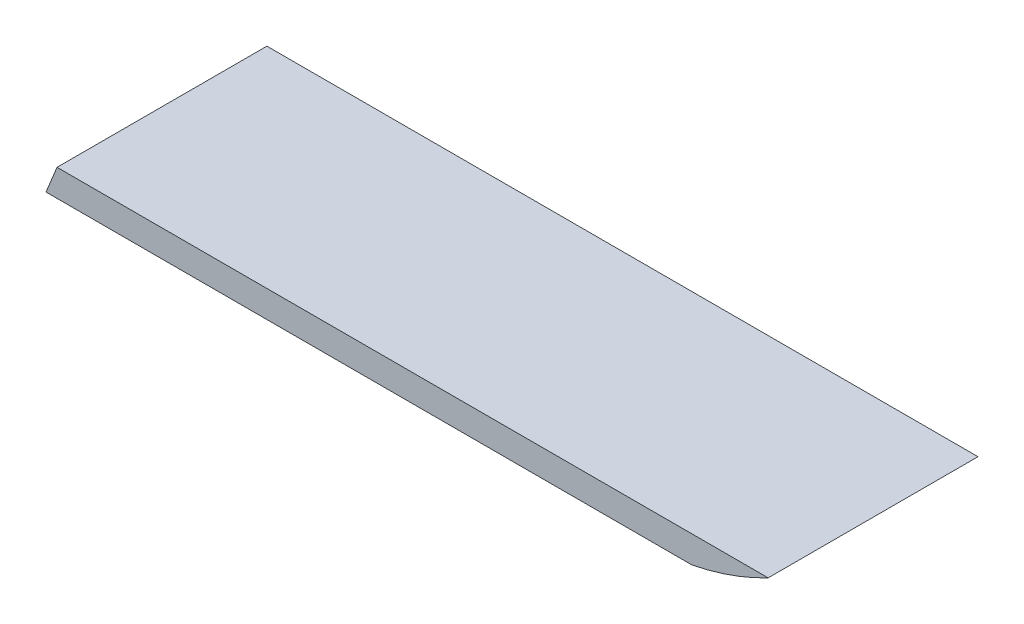
ISO-10303-21;
HEADER;
FILE_DESCRIPTION(('STEP AP214'),'2;1');
FILE_NAME('part.step','',(''),(''),'','','');
FILE_SCHEMA(('AUTOMOTIVE_DESIGN { 1 0 10303 214 1 1 1 1 }'));
ENDSEC;
DATA;
#1=APPLICATION_CONTEXT('core data for automotive mechanical design processes');
#2=APPLICATION_PROTOCOL_DEFINITION('international standard','automotive_design',2000,#1);
#3=PRODUCT_CONTEXT('',#1,'mechanical');
#4=PRODUCT('Part','Part','',(#3));
#5=PRODUCT_RELATED_PRODUCT_CATEGORY('part','',(#4));
#6=PRODUCT_DEFINITION_FORMATION('','',#4);
#7=PRODUCT_DEFINITION_CONTEXT('part definition',#1,'design');
#8=PRODUCT_DEFINITION('design','',#6,#7);
#9=PRODUCT_DEFINITION_SHAPE('','',#8);
#10=(LENGTH_UNIT() NAMED_UNIT(*) SI_UNIT(.MILLI.,.METRE.));
#11=(NAMED_UNIT(*) PLANE_ANGLE_UNIT() SI_UNIT($,.RADIAN.));
#12=(NAMED_UNIT(*) SI_UNIT($,.STERADIAN.) SOLID_ANGLE_UNIT());
#13=UNCERTAINTY_MEASURE_WITH_UNIT(LENGTH_MEASURE(1.E-05),#10,'distance_accuracy_value','');
#14=(GEOMETRIC_REPRESENTATION_CONTEXT(3) GLOBAL_UNCERTAINTY_ASSIGNED_CONTEXT((#13)) GLOBAL_UNIT_ASSIGNED_CONTEXT((#10,
#11,#12)) REPRESENTATION_CONTEXT('',''));
#15=CARTESIAN_POINT('',(0.,0.,0.));
#16=DIRECTION('',(0.,0.,1.));
#17=DIRECTION('',(1.,0.,0.));
#18=AXIS2_PLACEMENT_3D('',#15,#16,#17);
#19=CARTESIAN_POINT('',(-26.474240487687,6.005899301844,0.));
#20=DIRECTION('',(0.,0.,1.));
#21=DIRECTION('',(0.193929277363947,-0.981015512304009,0.));
#22=AXIS2_PLACEMENT_3D('',#19,#20,#21);
#23=CYLINDRICAL_SURFACE('',#22,0.133821831316658);
#24=CARTESIAN_POINT('',(-26.474240487687,6.005899301844,0.));
#25=DIRECTION('',(0.,0.,1.));
#26=DIRECTION('',(0.193929277363947,-0.981015512304009,0.));
#27=AXIS2_PLACEMENT_3D('',#24,#25,#26);
#28=CIRCLE('',#27,0.133821831316658);
#29=CARTESIAN_POINT('',(-26.448288516644,5.874618009437,0.));
#30=VERTEX_POINT('',#29);
#31=CARTESIAN_POINT('',(-26.41193732046,5.887465362914,0.));
#32=VERTEX_POINT('',#31);
#33=EDGE_CURVE('E11',#30,#32,#28,.T.);
#34=ORIENTED_EDGE('',*,*,#33,.T.);
#35=DIRECTION('',(0.,0.,1.));
#36=VECTOR('',#35,1.);
#37=CARTESIAN_POINT('',(-26.41193732046,5.887465362914,0.));
#38=LINE('',#37,#36);
#39=CARTESIAN_POINT('',(-26.41193732046,5.887465362914,0.1));
#40=VERTEX_POINT('',#39);
#41=EDGE_CURVE('E24',#32,#40,#38,.T.);
#42=ORIENTED_EDGE('',*,*,#41,.T.);
#43=CARTESIAN_POINT('',(-26.474240487687,6.005899301844,0.1));
#44=DIRECTION('',(0.,0.,1.));
#45=DIRECTION('',(0.193929277363947,-0.981015512304009,0.));
#46=AXIS2_PLACEMENT_3D('',#43,#44,#45);
#47=CIRCLE('',#46,0.133821831316658);
#48=CARTESIAN_POINT('',(-26.448288516644,5.874618009437,0.1));
#49=VERTEX_POINT('',#48);
#50=EDGE_CURVE('E75',#49,#40,#47,.T.);
#51=ORIENTED_EDGE('',*,*,#50,.F.);
#52=DIRECTION('',(0.,0.,1.));
#53=VECTOR('',#52,1.);
#54=CARTESIAN_POINT('',(-26.448288516644,5.874618009437,0.));
#55=LINE('',#54,#53);
#56=EDGE_CURVE('E86',#30,#49,#55,.T.);
#57=ORIENTED_EDGE('',*,*,#56,.F.);
#58=EDGE_LOOP('',(#34,#42,#51,#57));
#59=FACE_BOUND('',#58,.T.);
#60=ADVANCED_FACE('F17',(#59),#23,.T.);
#61=CARTESIAN_POINT('',(-26.756089269406,5.874618009437,0.));
#62=DIRECTION('',(0.,-1.,0.));
#63=DIRECTION('',(1.,0.,0.));
#64=AXIS2_PLACEMENT_3D('',#61,#62,#63);
#65=PLANE('',#64);
#66=DIRECTION('',(1.,0.,0.));
#67=VECTOR('',#66,1.);
#68=CARTESIAN_POINT('',(-26.756089269406,5.874618009437,0.));
#69=LINE('',#68,#67);
#70=CARTESIAN_POINT('',(-26.756089269406,5.874618009437,0.));
#71=VERTEX_POINT('',#70);
#72=EDGE_CURVE('E83',#71,#30,#69,.T.);
#73=ORIENTED_EDGE('',*,*,#72,.T.);
#74=ORIENTED_EDGE('',*,*,#56,.T.);
#75=DIRECTION('',(1.,0.,0.));
#76=VECTOR('',#75,1.);
#77=CARTESIAN_POINT('',(-26.756089269406,5.874618009437,0.1));
#78=LINE('',#77,#76);
#79=CARTESIAN_POINT('',(-26.756089269406,5.874618009437,0.1));
#80=VERTEX_POINT('',#79);
#81=EDGE_CURVE('E81',#80,#49,#78,.T.);
#82=ORIENTED_EDGE('',*,*,#81,.F.);
#83=DIRECTION('',(0.,0.,1.));
#84=VECTOR('',#83,1.);
#85=CARTESIAN_POINT('',(-26.756089269406,5.874618009437,0.));
#86=LINE('',#85,#84);
#87=EDGE_CURVE('E61',#71,#80,#86,.T.);
#88=ORIENTED_EDGE('',*,*,#87,.F.);
#89=EDGE_LOOP('',(#73,#74,#82,#88));
#90=FACE_BOUND('',#89,.T.);
#91=ADVANCED_FACE('F91',(#90),#65,.T.);
#92=CARTESIAN_POINT('',(-26.750822847244,5.887465362914,0.));
#93=DIRECTION('',(-0.925276999373106,0.37929207008729,0.));
#94=DIRECTION('',(-0.37929207008729,-0.925276999373106,0.));
#95=AXIS2_PLACEMENT_3D('',#92,#93,#94);
#96=PLANE('',#95);
#97=DIRECTION('',(-0.37929207008729,-0.925276999373106,0.));
#98=VECTOR('',#97,1.);
#99=CARTESIAN_POINT('',(-26.750822847244,5.887465362914,0.));
#100=LINE('',#99,#98);
#101=CARTESIAN_POINT('',(-26.750822847244,5.887465362914,0.));
#102=VERTEX_POINT('',#101);
#103=EDGE_CURVE('E65',#102,#71,#100,.T.);
#104=ORIENTED_EDGE('',*,*,#103,.T.);
#105=ORIENTED_EDGE('',*,*,#87,.T.);
#106=DIRECTION('',(-0.37929207008729,-0.925276999373106,0.));
#107=VECTOR('',#106,1.);
#108=CARTESIAN_POINT('',(-26.750822847244,5.887465362914,0.1));
#109=LINE('',#108,#107);
#110=CARTESIAN_POINT('',(-26.750822847244,5.887465362914,0.1));
#111=VERTEX_POINT('',#110);
#112=EDGE_CURVE('E54',#111,#80,#109,.T.);
#113=ORIENTED_EDGE('',*,*,#112,.F.);
#114=DIRECTION('',(0.,0.,1.));
#115=VECTOR('',#114,1.);
#116=CARTESIAN_POINT('',(-26.750822847244,5.887465362914,0.));
#117=LINE('',#116,#115);
#118=EDGE_CURVE('E58',#102,#111,#117,.T.);
#119=ORIENTED_EDGE('',*,*,#118,.F.);
#120=EDGE_LOOP('',(#104,#105,#113,#119));
#121=FACE_BOUND('',#120,.T.);
#122=ADVANCED_FACE('F57',(#121),#96,.T.);
#123=CARTESIAN_POINT('',(-26.41193732046,5.887465362914,0.));
#124=DIRECTION('',(0.,1.,0.));
#125=DIRECTION('',(-1.,0.,0.));
#126=AXIS2_PLACEMENT_3D('',#123,#124,#125);
#127=PLANE('',#126);
#128=DIRECTION('',(-1.,0.,0.));
#129=VECTOR('',#128,1.);
#130=CARTESIAN_POINT('',(-26.41193732046,5.887465362914,0.));
#131=LINE('',#130,#129);
#132=EDGE_CURVE('E71',#32,#102,#131,.T.);
#133=ORIENTED_EDGE('',*,*,#132,.T.);
#134=ORIENTED_EDGE('',*,*,#118,.T.);
#135=DIRECTION('',(-1.,0.,0.));
#136=VECTOR('',#135,1.);
#137=CARTESIAN_POINT('',(-26.41193732046,5.887465362914,0.1));
#138=LINE('',#137,#136);
#139=EDGE_CURVE('E70',#40,#111,#138,.T.);
#140=ORIENTED_EDGE('',*,*,#139,.F.);
#141=ORIENTED_EDGE('',*,*,#41,.F.);
#142=EDGE_LOOP('',(#133,#134,#140,#141));
#143=FACE_BOUND('',#142,.T.);
#144=ADVANCED_FACE('F69',(#143),#127,.T.);
#145=CARTESIAN_POINT('',(-26.587754775526,5.881294344513,0.1));
#146=DIRECTION('',(0.,0.,1.));
#147=DIRECTION('',(1.,0.,0.));
#148=AXIS2_PLACEMENT_3D('',#145,#146,#147);
#149=PLANE('',#148);
#150=ORIENTED_EDGE('',*,*,#139,.T.);
#151=ORIENTED_EDGE('',*,*,#112,.T.);
#152=ORIENTED_EDGE('',*,*,#81,.T.);
#153=ORIENTED_EDGE('',*,*,#50,.T.);
#154=EDGE_LOOP('',(#150,#151,#152,#153));
#155=FACE_BOUND('',#154,.T.);
#156=ADVANCED_FACE('F74',(#155),#149,.T.);
#157=CARTESIAN_POINT('',(-26.587754775526,5.881294344513,0.));
#158=DIRECTION('',(0.,0.,1.));
#159=DIRECTION('',(1.,0.,0.));
#160=AXIS2_PLACEMENT_3D('',#157,#158,#159);
#161=PLANE('',#160);
#162=ORIENTED_EDGE('',*,*,#132,.F.);
#163=ORIENTED_EDGE('',*,*,#33,.F.);
#164=ORIENTED_EDGE('',*,*,#72,.F.);
#165=ORIENTED_EDGE('',*,*,#103,.F.);
#166=EDGE_LOOP('',(#162,#163,#164,#165));
#167=FACE_BOUND('',#166,.T.);
#168=ADVANCED_FACE('F89',(#167),#161,.F.);
#169=CLOSED_SHELL('',(#60,#91,#122,#144,#156,#168));
#170=MANIFOLD_SOLID_BREP('B1',#169);
#171=ADVANCED_BREP_SHAPE_REPRESENTATION('',(#18,#170),#14);
#172=SHAPE_DEFINITION_REPRESENTATION(#9,#171);
ENDSEC;
END-ISO-10303-21;
